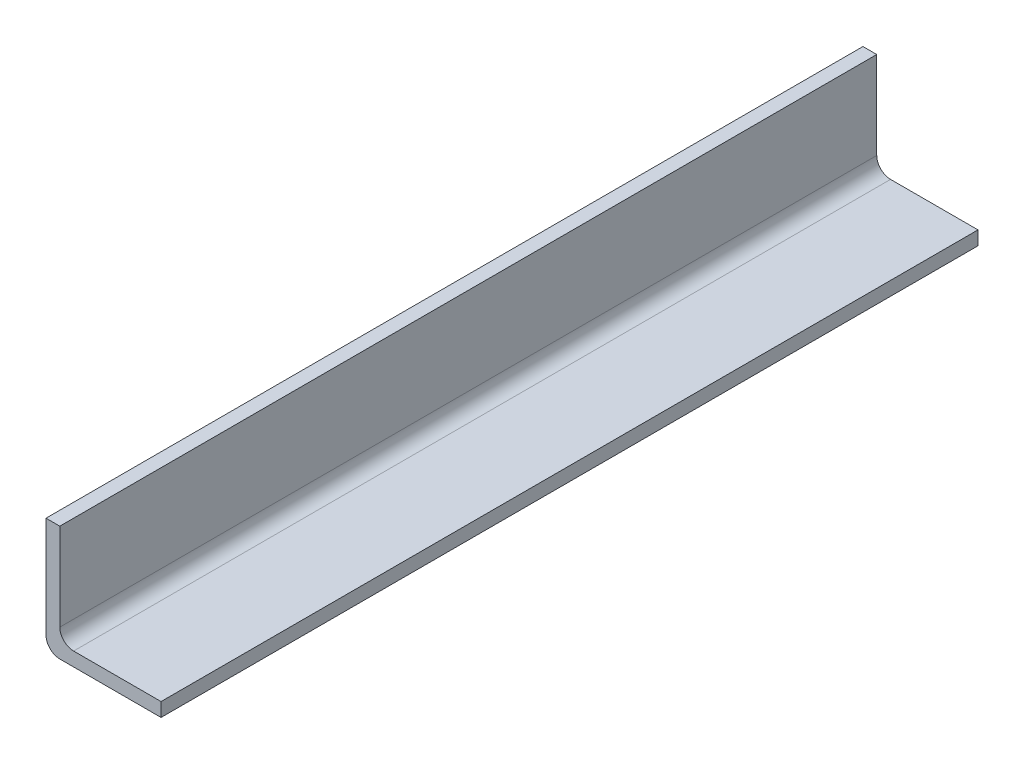
ISO-10303-21;
HEADER;
FILE_DESCRIPTION(('STEP AP214'),'2;1');
FILE_NAME('part.step','',(''),(''),'','','');
FILE_SCHEMA(('AUTOMOTIVE_DESIGN { 1 0 10303 214 1 1 1 1 }'));
ENDSEC;
DATA;
#1=APPLICATION_CONTEXT('core data for automotive mechanical design processes');
#2=APPLICATION_PROTOCOL_DEFINITION('international standard','automotive_design',2000,#1);
#3=PRODUCT_CONTEXT('',#1,'mechanical');
#4=PRODUCT('Part','Part','',(#3));
#5=PRODUCT_RELATED_PRODUCT_CATEGORY('part','',(#4));
#6=PRODUCT_DEFINITION_FORMATION('','',#4);
#7=PRODUCT_DEFINITION_CONTEXT('part definition',#1,'design');
#8=PRODUCT_DEFINITION('design','',#6,#7);
#9=PRODUCT_DEFINITION_SHAPE('','',#8);
#10=(LENGTH_UNIT() NAMED_UNIT(*) SI_UNIT(.MILLI.,.METRE.));
#11=(NAMED_UNIT(*) PLANE_ANGLE_UNIT() SI_UNIT($,.RADIAN.));
#12=(NAMED_UNIT(*) SI_UNIT($,.STERADIAN.) SOLID_ANGLE_UNIT());
#13=UNCERTAINTY_MEASURE_WITH_UNIT(LENGTH_MEASURE(1.E-05),#10,'distance_accuracy_value','');
#14=(GEOMETRIC_REPRESENTATION_CONTEXT(3) GLOBAL_UNCERTAINTY_ASSIGNED_CONTEXT((#13)) GLOBAL_UNIT_ASSIGNED_CONTEXT((#10,
#11,#12)) REPRESENTATION_CONTEXT('',''));
#15=CARTESIAN_POINT('',(0.,0.,0.));
#16=DIRECTION('',(0.,0.,1.));
#17=DIRECTION('',(1.,0.,0.));
#18=AXIS2_PLACEMENT_3D('',#15,#16,#17);
#19=CARTESIAN_POINT('',(0.,0.,355.));
#20=DIRECTION('',(0.,1.,0.));
#21=DIRECTION('',(0.,0.,1.));
#22=AXIS2_PLACEMENT_3D('',#19,#20,#21);
#23=PLANE('',#22);
#24=DIRECTION('',(1.,0.,0.));
#25=VECTOR('',#24,1.);
#26=CARTESIAN_POINT('',(0.,0.,355.));
#27=LINE('',#26,#25);
#28=CARTESIAN_POINT('',(6.,0.,355.));
#29=VERTEX_POINT('',#28);
#30=CARTESIAN_POINT('',(50.,0.,355.));
#31=VERTEX_POINT('',#30);
#32=EDGE_CURVE('E98',#29,#31,#27,.T.);
#33=ORIENTED_EDGE('',*,*,#32,.F.);
#34=DIRECTION('',(0.,0.,-1.));
#35=VECTOR('',#34,1.);
#36=CARTESIAN_POINT('',(6.,0.,355.));
#37=LINE('',#36,#35);
#38=CARTESIAN_POINT('',(6.,0.,0.));
#39=VERTEX_POINT('',#38);
#40=EDGE_CURVE('E133',#29,#39,#37,.T.);
#41=ORIENTED_EDGE('',*,*,#40,.T.);
#42=DIRECTION('',(1.,0.,0.));
#43=VECTOR('',#42,1.);
#44=CARTESIAN_POINT('',(0.,0.,0.));
#45=LINE('',#44,#43);
#46=CARTESIAN_POINT('',(50.,0.,0.));
#47=VERTEX_POINT('',#46);
#48=EDGE_CURVE('E121',#39,#47,#45,.T.);
#49=ORIENTED_EDGE('',*,*,#48,.T.);
#50=DIRECTION('',(0.,0.,-1.));
#51=VECTOR('',#50,1.);
#52=CARTESIAN_POINT('',(50.,0.,355.));
#53=LINE('',#52,#51);
#54=EDGE_CURVE('E115',#31,#47,#53,.T.);
#55=ORIENTED_EDGE('',*,*,#54,.F.);
#56=EDGE_LOOP('',(#33,#41,#49,#55));
#57=FACE_BOUND('',#56,.T.);
#58=ADVANCED_FACE('F33',(#57),#23,.F.);
#59=CARTESIAN_POINT('',(50.,6.,355.));
#60=DIRECTION('',(-1.,0.,0.));
#61=DIRECTION('',(0.,0.,1.));
#62=AXIS2_PLACEMENT_3D('',#59,#60,#61);
#63=PLANE('',#62);
#64=DIRECTION('',(0.,1.,0.));
#65=VECTOR('',#64,1.);
#66=CARTESIAN_POINT('',(50.,6.,0.));
#67=LINE('',#66,#65);
#68=CARTESIAN_POINT('',(50.,6.,0.));
#69=VERTEX_POINT('',#68);
#70=EDGE_CURVE('E149',#47,#69,#67,.T.);
#71=ORIENTED_EDGE('',*,*,#70,.T.);
#72=DIRECTION('',(0.,0.,-1.));
#73=VECTOR('',#72,1.);
#74=CARTESIAN_POINT('',(50.,6.,355.));
#75=LINE('',#74,#73);
#76=CARTESIAN_POINT('',(50.,6.,355.));
#77=VERTEX_POINT('',#76);
#78=EDGE_CURVE('E117',#77,#69,#75,.T.);
#79=ORIENTED_EDGE('',*,*,#78,.F.);
#80=DIRECTION('',(0.,1.,0.));
#81=VECTOR('',#80,1.);
#82=CARTESIAN_POINT('',(50.,6.,355.));
#83=LINE('',#82,#81);
#84=EDGE_CURVE('E102',#31,#77,#83,.T.);
#85=ORIENTED_EDGE('',*,*,#84,.F.);
#86=ORIENTED_EDGE('',*,*,#54,.T.);
#87=EDGE_LOOP('',(#71,#79,#85,#86));
#88=FACE_BOUND('',#87,.T.);
#89=ADVANCED_FACE('F114',(#88),#63,.F.);
#90=CARTESIAN_POINT('',(6.,6.,355.));
#91=DIRECTION('',(0.,-1.,0.));
#92=DIRECTION('',(0.,0.,-1.));
#93=AXIS2_PLACEMENT_3D('',#90,#91,#92);
#94=PLANE('',#93);
#95=DIRECTION('',(-1.,0.,0.));
#96=VECTOR('',#95,1.);
#97=CARTESIAN_POINT('',(6.,6.,0.));
#98=LINE('',#97,#96);
#99=CARTESIAN_POINT('',(12.,6.,0.));
#100=VERTEX_POINT('',#99);
#101=EDGE_CURVE('E141',#69,#100,#98,.T.);
#102=ORIENTED_EDGE('',*,*,#101,.T.);
#103=DIRECTION('',(0.,0.,-1.));
#104=VECTOR('',#103,1.);
#105=CARTESIAN_POINT('',(12.,6.,355.));
#106=LINE('',#105,#104);
#107=CARTESIAN_POINT('',(12.,6.,355.));
#108=VERTEX_POINT('',#107);
#109=EDGE_CURVE('E126',#100,#108,#106,.F.);
#110=ORIENTED_EDGE('',*,*,#109,.T.);
#111=DIRECTION('',(-1.,0.,0.));
#112=VECTOR('',#111,1.);
#113=CARTESIAN_POINT('',(6.,6.,355.));
#114=LINE('',#113,#112);
#115=EDGE_CURVE('E119',#77,#108,#114,.T.);
#116=ORIENTED_EDGE('',*,*,#115,.F.);
#117=ORIENTED_EDGE('',*,*,#78,.T.);
#118=EDGE_LOOP('',(#102,#110,#116,#117));
#119=FACE_BOUND('',#118,.T.);
#120=ADVANCED_FACE('F148',(#119),#94,.F.);
#121=CARTESIAN_POINT('',(6.,6.,355.));
#122=DIRECTION('',(-1.,0.,0.));
#123=DIRECTION('',(0.,0.,1.));
#124=AXIS2_PLACEMENT_3D('',#121,#122,#123);
#125=PLANE('',#124);
#126=DIRECTION('',(0.,1.,0.));
#127=VECTOR('',#126,1.);
#128=CARTESIAN_POINT('',(6.,6.,355.));
#129=LINE('',#128,#127);
#130=CARTESIAN_POINT('',(6.,12.,355.));
#131=VERTEX_POINT('',#130);
#132=CARTESIAN_POINT('',(6.,50.,355.));
#133=VERTEX_POINT('',#132);
#134=EDGE_CURVE('E154',#131,#133,#129,.T.);
#135=ORIENTED_EDGE('',*,*,#134,.F.);
#136=DIRECTION('',(0.,0.,-1.));
#137=VECTOR('',#136,1.);
#138=CARTESIAN_POINT('',(6.,12.,0.));
#139=LINE('',#138,#137);
#140=CARTESIAN_POINT('',(6.,12.,0.));
#141=VERTEX_POINT('',#140);
#142=EDGE_CURVE('E123',#131,#141,#139,.T.);
#143=ORIENTED_EDGE('',*,*,#142,.T.);
#144=DIRECTION('',(0.,1.,0.));
#145=VECTOR('',#144,1.);
#146=CARTESIAN_POINT('',(6.,6.,0.));
#147=LINE('',#146,#145);
#148=CARTESIAN_POINT('',(6.,50.,0.));
#149=VERTEX_POINT('',#148);
#150=EDGE_CURVE('E143',#141,#149,#147,.T.);
#151=ORIENTED_EDGE('',*,*,#150,.T.);
#152=DIRECTION('',(0.,0.,-1.));
#153=VECTOR('',#152,1.);
#154=CARTESIAN_POINT('',(6.,50.,355.));
#155=LINE('',#154,#153);
#156=EDGE_CURVE('E128',#133,#149,#155,.T.);
#157=ORIENTED_EDGE('',*,*,#156,.F.);
#158=EDGE_LOOP('',(#135,#143,#151,#157));
#159=FACE_BOUND('',#158,.T.);
#160=ADVANCED_FACE('F157',(#159),#125,.F.);
#161=CARTESIAN_POINT('',(0.,50.,355.));
#162=DIRECTION('',(0.,-1.,0.));
#163=DIRECTION('',(0.,0.,-1.));
#164=AXIS2_PLACEMENT_3D('',#161,#162,#163);
#165=PLANE('',#164);
#166=DIRECTION('',(-1.,0.,0.));
#167=VECTOR('',#166,1.);
#168=CARTESIAN_POINT('',(0.,50.,0.));
#169=LINE('',#168,#167);
#170=CARTESIAN_POINT('',(0.,50.,0.));
#171=VERTEX_POINT('',#170);
#172=EDGE_CURVE('E171',#149,#171,#169,.T.);
#173=ORIENTED_EDGE('',*,*,#172,.T.);
#174=DIRECTION('',(0.,0.,-1.));
#175=VECTOR('',#174,1.);
#176=CARTESIAN_POINT('',(0.,50.,355.));
#177=LINE('',#176,#175);
#178=CARTESIAN_POINT('',(0.,50.,355.));
#179=VERTEX_POINT('',#178);
#180=EDGE_CURVE('E167',#179,#171,#177,.T.);
#181=ORIENTED_EDGE('',*,*,#180,.F.);
#182=DIRECTION('',(-1.,0.,0.));
#183=VECTOR('',#182,1.);
#184=CARTESIAN_POINT('',(0.,50.,355.));
#185=LINE('',#184,#183);
#186=EDGE_CURVE('E160',#133,#179,#185,.T.);
#187=ORIENTED_EDGE('',*,*,#186,.F.);
#188=ORIENTED_EDGE('',*,*,#156,.T.);
#189=EDGE_LOOP('',(#173,#181,#187,#188));
#190=FACE_BOUND('',#189,.T.);
#191=ADVANCED_FACE('F176',(#190),#165,.F.);
#192=CARTESIAN_POINT('',(0.,0.,355.));
#193=DIRECTION('',(1.,0.,0.));
#194=DIRECTION('',(0.,0.,-1.));
#195=AXIS2_PLACEMENT_3D('',#192,#193,#194);
#196=PLANE('',#195);
#197=DIRECTION('',(0.,-1.,0.));
#198=VECTOR('',#197,1.);
#199=CARTESIAN_POINT('',(0.,0.,0.));
#200=LINE('',#199,#198);
#201=CARTESIAN_POINT('',(0.,6.,0.));
#202=VERTEX_POINT('',#201);
#203=EDGE_CURVE('E110',#171,#202,#200,.T.);
#204=ORIENTED_EDGE('',*,*,#203,.T.);
#205=DIRECTION('',(0.,0.,-1.));
#206=VECTOR('',#205,1.);
#207=CARTESIAN_POINT('',(0.,6.,355.));
#208=LINE('',#207,#206);
#209=CARTESIAN_POINT('',(0.,6.,355.));
#210=VERTEX_POINT('',#209);
#211=EDGE_CURVE('E48',#202,#210,#208,.F.);
#212=ORIENTED_EDGE('',*,*,#211,.T.);
#213=DIRECTION('',(0.,-1.,0.));
#214=VECTOR('',#213,1.);
#215=CARTESIAN_POINT('',(0.,0.,355.));
#216=LINE('',#215,#214);
#217=EDGE_CURVE('E162',#179,#210,#216,.T.);
#218=ORIENTED_EDGE('',*,*,#217,.F.);
#219=ORIENTED_EDGE('',*,*,#180,.T.);
#220=EDGE_LOOP('',(#204,#212,#218,#219));
#221=FACE_BOUND('',#220,.T.);
#222=ADVANCED_FACE('F178',(#221),#196,.F.);
#223=CARTESIAN_POINT('',(0.,0.,355.));
#224=DIRECTION('',(0.,0.,-1.));
#225=DIRECTION('',(-1.,0.,0.));
#226=AXIS2_PLACEMENT_3D('',#223,#224,#225);
#227=PLANE('',#226);
#228=ORIENTED_EDGE('',*,*,#217,.T.);
#229=CARTESIAN_POINT('',(6.,6.,355.));
#230=DIRECTION('',(0.,0.,-1.));
#231=DIRECTION('',(-1.,0.,0.));
#232=AXIS2_PLACEMENT_3D('',#229,#230,#231);
#233=CIRCLE('',#232,6.);
#234=EDGE_CURVE('E105',#210,#29,#233,.F.);
#235=ORIENTED_EDGE('',*,*,#234,.T.);
#236=ORIENTED_EDGE('',*,*,#32,.T.);
#237=ORIENTED_EDGE('',*,*,#84,.T.);
#238=ORIENTED_EDGE('',*,*,#115,.T.);
#239=CARTESIAN_POINT('',(12.,12.,355.));
#240=DIRECTION('',(0.,0.,-1.));
#241=DIRECTION('',(-1.,0.,0.));
#242=AXIS2_PLACEMENT_3D('',#239,#240,#241);
#243=CIRCLE('',#242,6.);
#244=EDGE_CURVE('E11',#108,#131,#243,.T.);
#245=ORIENTED_EDGE('',*,*,#244,.T.);
#246=ORIENTED_EDGE('',*,*,#134,.T.);
#247=ORIENTED_EDGE('',*,*,#186,.T.);
#248=EDGE_LOOP('',(#228,#235,#236,#237,#238,#245,#246,#247));
#249=FACE_BOUND('',#248,.T.);
#250=ADVANCED_FACE('F100',(#249),#227,.F.);
#251=CARTESIAN_POINT('',(0.,0.,0.));
#252=DIRECTION('',(0.,0.,-1.));
#253=DIRECTION('',(-1.,0.,0.));
#254=AXIS2_PLACEMENT_3D('',#251,#252,#253);
#255=PLANE('',#254);
#256=ORIENTED_EDGE('',*,*,#48,.F.);
#257=CARTESIAN_POINT('',(6.,6.,0.));
#258=DIRECTION('',(0.,0.,-1.));
#259=DIRECTION('',(-1.,0.,0.));
#260=AXIS2_PLACEMENT_3D('',#257,#258,#259);
#261=CIRCLE('',#260,6.);
#262=EDGE_CURVE('E56',#39,#202,#261,.T.);
#263=ORIENTED_EDGE('',*,*,#262,.T.);
#264=ORIENTED_EDGE('',*,*,#203,.F.);
#265=ORIENTED_EDGE('',*,*,#172,.F.);
#266=ORIENTED_EDGE('',*,*,#150,.F.);
#267=CARTESIAN_POINT('',(12.,12.,0.));
#268=DIRECTION('',(0.,0.,-1.));
#269=DIRECTION('',(-1.,0.,0.));
#270=AXIS2_PLACEMENT_3D('',#267,#268,#269);
#271=CIRCLE('',#270,6.);
#272=EDGE_CURVE('E41',#141,#100,#271,.F.);
#273=ORIENTED_EDGE('',*,*,#272,.T.);
#274=ORIENTED_EDGE('',*,*,#101,.F.);
#275=ORIENTED_EDGE('',*,*,#70,.F.);
#276=EDGE_LOOP('',(#256,#263,#264,#265,#266,#273,#274,#275));
#277=FACE_BOUND('',#276,.T.);
#278=ADVANCED_FACE('F140',(#277),#255,.T.);
#279=CARTESIAN_POINT('',(12.,12.,355.));
#280=DIRECTION('',(0.,0.,1.));
#281=DIRECTION('',(1.,0.,0.));
#282=AXIS2_PLACEMENT_3D('',#279,#280,#281);
#283=CYLINDRICAL_SURFACE('',#282,6.);
#284=ORIENTED_EDGE('',*,*,#244,.F.);
#285=ORIENTED_EDGE('',*,*,#109,.F.);
#286=ORIENTED_EDGE('',*,*,#272,.F.);
#287=ORIENTED_EDGE('',*,*,#142,.F.);
#288=EDGE_LOOP('',(#284,#285,#286,#287));
#289=FACE_BOUND('',#288,.T.);
#290=ADVANCED_FACE('F152',(#289),#283,.F.);
#291=CARTESIAN_POINT('',(6.,6.,355.));
#292=DIRECTION('',(0.,0.,-1.));
#293=DIRECTION('',(-1.,0.,0.));
#294=AXIS2_PLACEMENT_3D('',#291,#292,#293);
#295=CYLINDRICAL_SURFACE('',#294,6.);
#296=ORIENTED_EDGE('',*,*,#234,.F.);
#297=ORIENTED_EDGE('',*,*,#211,.F.);
#298=ORIENTED_EDGE('',*,*,#262,.F.);
#299=ORIENTED_EDGE('',*,*,#40,.F.);
#300=EDGE_LOOP('',(#296,#297,#298,#299));
#301=FACE_BOUND('',#300,.T.);
#302=ADVANCED_FACE('F35',(#301),#295,.T.);
#303=CLOSED_SHELL('',(#58,#89,#120,#160,#191,#222,#250,#278,#290,#302));
#304=MANIFOLD_SOLID_BREP('B2',#303);
#305=ADVANCED_BREP_SHAPE_REPRESENTATION('',(#18,#304),#14);
#306=SHAPE_DEFINITION_REPRESENTATION(#9,#305);
ENDSEC;
END-ISO-10303-21;
